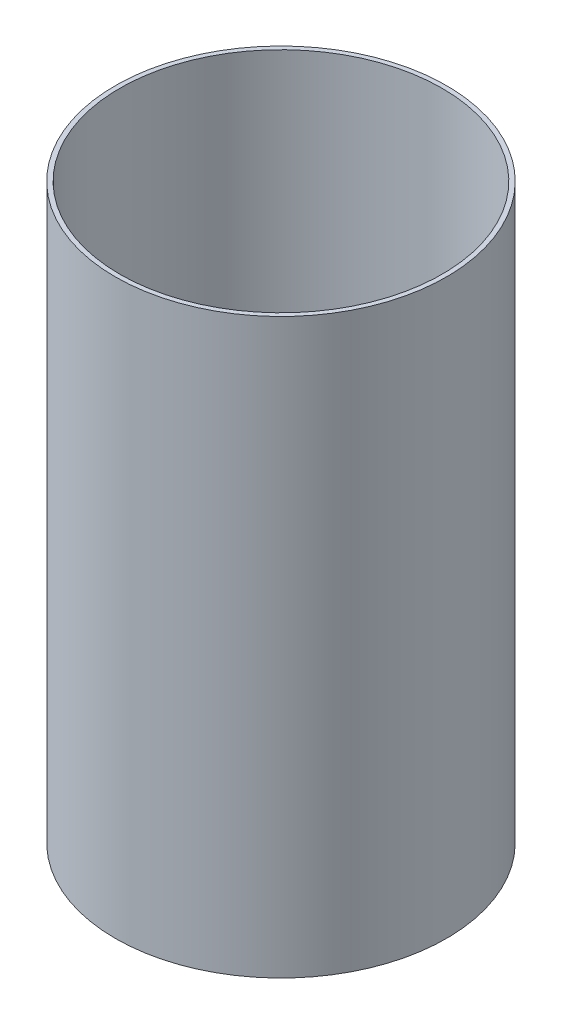
ISO-10303-21;
HEADER;
FILE_DESCRIPTION(('STEP AP214'),'2;1');
FILE_NAME('part.step','',(''),(''),'','','');
FILE_SCHEMA(('AUTOMOTIVE_DESIGN { 1 0 10303 214 1 1 1 1 }'));
ENDSEC;
DATA;
#1=APPLICATION_CONTEXT('core data for automotive mechanical design processes');
#2=APPLICATION_PROTOCOL_DEFINITION('international standard','automotive_design',2000,#1);
#3=PRODUCT_CONTEXT('',#1,'mechanical');
#4=PRODUCT('Part','Part','',(#3));
#5=PRODUCT_RELATED_PRODUCT_CATEGORY('part','',(#4));
#6=PRODUCT_DEFINITION_FORMATION('','',#4);
#7=PRODUCT_DEFINITION_CONTEXT('part definition',#1,'design');
#8=PRODUCT_DEFINITION('design','',#6,#7);
#9=PRODUCT_DEFINITION_SHAPE('','',#8);
#10=(LENGTH_UNIT() NAMED_UNIT(*) SI_UNIT(.MILLI.,.METRE.));
#11=(NAMED_UNIT(*) PLANE_ANGLE_UNIT() SI_UNIT($,.RADIAN.));
#12=(NAMED_UNIT(*) SI_UNIT($,.STERADIAN.) SOLID_ANGLE_UNIT());
#13=UNCERTAINTY_MEASURE_WITH_UNIT(LENGTH_MEASURE(1.E-05),#10,'distance_accuracy_value','');
#14=(GEOMETRIC_REPRESENTATION_CONTEXT(3) GLOBAL_UNCERTAINTY_ASSIGNED_CONTEXT((#13)) GLOBAL_UNIT_ASSIGNED_CONTEXT((#10,
#11,#12)) REPRESENTATION_CONTEXT('',''));
#15=CARTESIAN_POINT('',(0.,0.,0.));
#16=DIRECTION('',(0.,0.,1.));
#17=DIRECTION('',(1.,0.,0.));
#18=AXIS2_PLACEMENT_3D('',#15,#16,#17);
#19=CARTESIAN_POINT('',(0.,25.4,0.));
#20=DIRECTION('',(0.,1.,0.));
#21=DIRECTION('',(0.,0.,1.));
#22=AXIS2_PLACEMENT_3D('',#19,#20,#21);
#23=PLANE('',#22);
#24=CARTESIAN_POINT('',(0.,25.4,0.));
#25=DIRECTION('',(0.,1.,0.));
#26=DIRECTION('',(0.,0.,1.));
#27=AXIS2_PLACEMENT_3D('',#24,#25,#26);
#28=CIRCLE('',#27,14.6875);
#29=CARTESIAN_POINT('',(0.,25.4,14.6875));
#30=VERTEX_POINT('',#29);
#31=EDGE_CURVE('E10',#30,#30,#28,.T.);
#32=ORIENTED_EDGE('',*,*,#31,.T.);
#33=EDGE_LOOP('',(#32));
#34=FACE_BOUND('',#33,.T.);
#35=CARTESIAN_POINT('',(0.,25.4,0.));
#36=DIRECTION('',(0.,1.,0.));
#37=DIRECTION('',(0.,0.,1.));
#38=AXIS2_PLACEMENT_3D('',#35,#36,#37);
#39=CIRCLE('',#38,14.2875);
#40=CARTESIAN_POINT('',(0.,25.4,14.2875));
#41=VERTEX_POINT('',#40);
#42=EDGE_CURVE('E44',#41,#41,#39,.T.);
#43=ORIENTED_EDGE('',*,*,#42,.F.);
#44=EDGE_LOOP('',(#43));
#45=FACE_BOUND('',#44,.T.);
#46=ADVANCED_FACE('F33',(#34,#45),#23,.T.);
#47=CARTESIAN_POINT('',(0.,-25.4,0.));
#48=DIRECTION('',(0.,1.,0.));
#49=DIRECTION('',(0.,0.,1.));
#50=AXIS2_PLACEMENT_3D('',#47,#48,#49);
#51=PLANE('',#50);
#52=CARTESIAN_POINT('',(0.,-25.4,0.));
#53=DIRECTION('',(0.,1.,0.));
#54=DIRECTION('',(0.,0.,1.));
#55=AXIS2_PLACEMENT_3D('',#52,#53,#54);
#56=CIRCLE('',#55,14.6875);
#57=CARTESIAN_POINT('',(0.,-25.4,14.6875));
#58=VERTEX_POINT('',#57);
#59=EDGE_CURVE('E37',#58,#58,#56,.T.);
#60=ORIENTED_EDGE('',*,*,#59,.F.);
#61=EDGE_LOOP('',(#60));
#62=FACE_BOUND('',#61,.T.);
#63=CARTESIAN_POINT('',(0.,-25.4,0.));
#64=DIRECTION('',(0.,1.,0.));
#65=DIRECTION('',(0.,0.,1.));
#66=AXIS2_PLACEMENT_3D('',#63,#64,#65);
#67=CIRCLE('',#66,14.2875);
#68=CARTESIAN_POINT('',(0.,-25.4,14.2875));
#69=VERTEX_POINT('',#68);
#70=EDGE_CURVE('E46',#69,#69,#67,.T.);
#71=ORIENTED_EDGE('',*,*,#70,.T.);
#72=EDGE_LOOP('',(#71));
#73=FACE_BOUND('',#72,.T.);
#74=ADVANCED_FACE('F56',(#62,#73),#51,.F.);
#75=CARTESIAN_POINT('',(0.,25.4,0.));
#76=DIRECTION('',(0.,-1.,0.));
#77=DIRECTION('',(0.,0.,-1.));
#78=AXIS2_PLACEMENT_3D('',#75,#76,#77);
#79=CYLINDRICAL_SURFACE('',#78,14.6875);
#80=ORIENTED_EDGE('',*,*,#31,.F.);
#81=EDGE_LOOP('',(#80));
#82=FACE_BOUND('',#81,.T.);
#83=ORIENTED_EDGE('',*,*,#59,.T.);
#84=EDGE_LOOP('',(#83));
#85=FACE_BOUND('',#84,.T.);
#86=ADVANCED_FACE('F35',(#82,#85),#79,.T.);
#87=CARTESIAN_POINT('',(0.,25.4,0.));
#88=DIRECTION('',(0.,-1.,0.));
#89=DIRECTION('',(0.,0.,-1.));
#90=AXIS2_PLACEMENT_3D('',#87,#88,#89);
#91=CYLINDRICAL_SURFACE('',#90,14.2875);
#92=ORIENTED_EDGE('',*,*,#42,.T.);
#93=EDGE_LOOP('',(#92));
#94=FACE_BOUND('',#93,.T.);
#95=ORIENTED_EDGE('',*,*,#70,.F.);
#96=EDGE_LOOP('',(#95));
#97=FACE_BOUND('',#96,.T.);
#98=ADVANCED_FACE('F52',(#94,#97),#91,.F.);
#99=CLOSED_SHELL('',(#46,#74,#86,#98));
#100=MANIFOLD_SOLID_BREP('B2',#99);
#101=ADVANCED_BREP_SHAPE_REPRESENTATION('',(#18,#100),#14);
#102=SHAPE_DEFINITION_REPRESENTATION(#9,#101);
ENDSEC;
END-ISO-10303-21;
